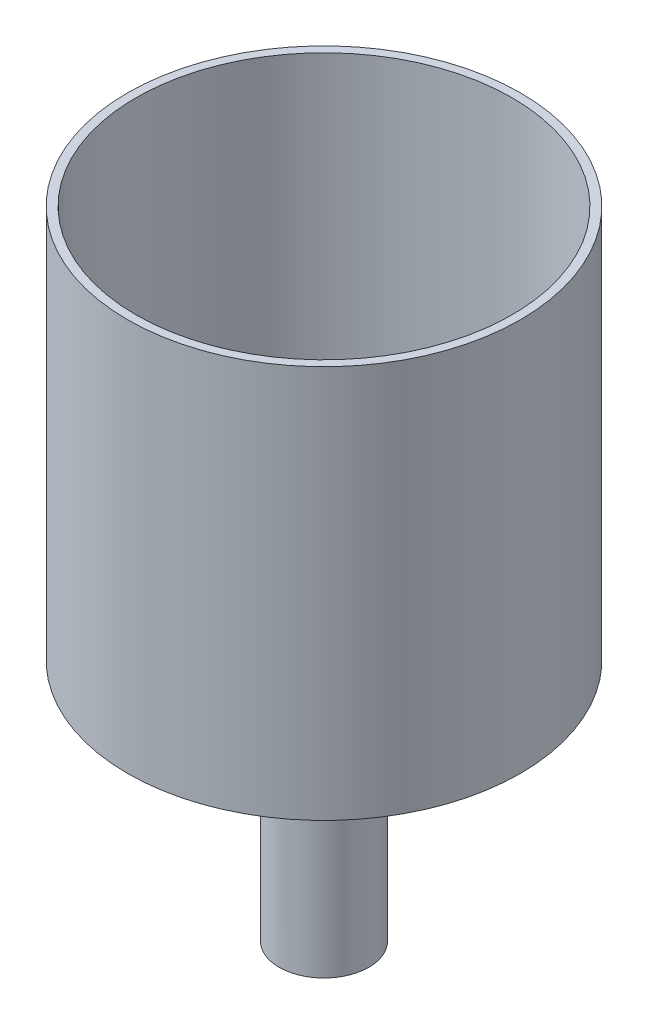
ISO-10303-21;
HEADER;
FILE_DESCRIPTION(('STEP AP214'),'2;1');
FILE_NAME('part.step','',(''),(''),'','','');
FILE_SCHEMA(('AUTOMOTIVE_DESIGN { 1 0 10303 214 1 1 1 1 }'));
ENDSEC;
DATA;
#1=APPLICATION_CONTEXT('core data for automotive mechanical design processes');
#2=APPLICATION_PROTOCOL_DEFINITION('international standard','automotive_design',2000,#1);
#3=PRODUCT_CONTEXT('',#1,'mechanical');
#4=PRODUCT('Part','Part','',(#3));
#5=PRODUCT_RELATED_PRODUCT_CATEGORY('part','',(#4));
#6=PRODUCT_DEFINITION_FORMATION('','',#4);
#7=PRODUCT_DEFINITION_CONTEXT('part definition',#1,'design');
#8=PRODUCT_DEFINITION('design','',#6,#7);
#9=PRODUCT_DEFINITION_SHAPE('','',#8);
#10=(LENGTH_UNIT() NAMED_UNIT(*) SI_UNIT(.MILLI.,.METRE.));
#11=(NAMED_UNIT(*) PLANE_ANGLE_UNIT() SI_UNIT($,.RADIAN.));
#12=(NAMED_UNIT(*) SI_UNIT($,.STERADIAN.) SOLID_ANGLE_UNIT());
#13=UNCERTAINTY_MEASURE_WITH_UNIT(LENGTH_MEASURE(1.E-05),#10,'distance_accuracy_value','');
#14=(GEOMETRIC_REPRESENTATION_CONTEXT(3) GLOBAL_UNCERTAINTY_ASSIGNED_CONTEXT((#13)) GLOBAL_UNIT_ASSIGNED_CONTEXT((#10,
#11,#12)) REPRESENTATION_CONTEXT('',''));
#15=CARTESIAN_POINT('',(0.,0.,0.));
#16=DIRECTION('',(0.,0.,1.));
#17=DIRECTION('',(1.,0.,0.));
#18=AXIS2_PLACEMENT_3D('',#15,#16,#17);
#19=CARTESIAN_POINT('',(0.,45.,0.));
#20=DIRECTION('',(0.,-1.,0.));
#21=DIRECTION('',(0.,0.,-1.));
#22=AXIS2_PLACEMENT_3D('',#19,#20,#21);
#23=CYLINDRICAL_SURFACE('',#22,8.);
#24=CARTESIAN_POINT('',(0.,1.59512829498445,0.));
#25=DIRECTION('',(0.,1.,0.));
#26=DIRECTION('',(0.,0.,1.));
#27=AXIS2_PLACEMENT_3D('',#24,#25,#26);
#28=CIRCLE('',#27,8.);
#29=CARTESIAN_POINT('',(0.,1.59512829498445,-8.));
#30=VERTEX_POINT('',#29);
#31=EDGE_CURVE('E54',#30,#30,#28,.T.);
#32=CARTESIAN_POINT('',(0.,45.,0.));
#33=DIRECTION('',(0.,1.,0.));
#34=DIRECTION('',(0.,0.,1.));
#35=AXIS2_PLACEMENT_3D('',#32,#33,#34);
#36=CIRCLE('',#35,8.);
#37=CARTESIAN_POINT('',(0.,45.,-8.));
#38=VERTEX_POINT('',#37);
#39=EDGE_CURVE('E59',#38,#38,#36,.T.);
#40=CARTESIAN_POINT('',(0.,1.59512829498445,-8.));
#41=CARTESIAN_POINT('',(0.,2.04726237524503,-8.));
#42=CARTESIAN_POINT('',(0.,2.4993964555056,-8.));
#43=CARTESIAN_POINT('',(0.,3.40366461602676,-8.));
#44=CARTESIAN_POINT('',(0.,3.85579869628734,-8.));
#45=CARTESIAN_POINT('',(0.,4.7600668568085,-8.));
#46=CARTESIAN_POINT('',(0.,5.21220093706908,-8.));
#47=CARTESIAN_POINT('',(0.,6.11646909759024,-8.));
#48=CARTESIAN_POINT('',(0.,6.56860317785081,-8.));
#49=CARTESIAN_POINT('',(0.,7.47287133837197,-8.));
#50=CARTESIAN_POINT('',(0.,7.92500541863255,-8.));
#51=CARTESIAN_POINT('',(0.,8.82927357915371,-8.));
#52=CARTESIAN_POINT('',(0.,9.28140765941428,-8.));
#53=CARTESIAN_POINT('',(0.,10.1856758199354,-8.));
#54=CARTESIAN_POINT('',(0.,10.637809900196,-8.));
#55=CARTESIAN_POINT('',(0.,11.5420780607172,-8.));
#56=CARTESIAN_POINT('',(0.,11.9942121409778,-8.));
#57=CARTESIAN_POINT('',(0.,12.8984803014989,-8.));
#58=CARTESIAN_POINT('',(0.,13.3506143817595,-8.));
#59=CARTESIAN_POINT('',(0.,14.2548825422806,-8.));
#60=CARTESIAN_POINT('',(0.,14.7070166225412,-8.));
#61=CARTESIAN_POINT('',(0.,15.6112847830624,-8.));
#62=CARTESIAN_POINT('',(0.,16.063418863323,-8.));
#63=CARTESIAN_POINT('',(0.,16.9676870238441,-8.));
#64=CARTESIAN_POINT('',(0.,17.4198211041047,-8.));
#65=CARTESIAN_POINT('',(0.,18.3240892646259,-8.));
#66=CARTESIAN_POINT('',(0.,18.7762233448864,-8.));
#67=CARTESIAN_POINT('',(0.,19.6804915054076,-8.));
#68=CARTESIAN_POINT('',(0.,20.1326255856682,-8.));
#69=CARTESIAN_POINT('',(0.,21.0368937461893,-8.));
#70=CARTESIAN_POINT('',(0.,21.4890278264499,-8.));
#71=CARTESIAN_POINT('',(0.,22.3932959869711,-8.));
#72=CARTESIAN_POINT('',(0.,22.8454300672316,-8.));
#73=CARTESIAN_POINT('',(0.,23.7496982277528,-8.));
#74=CARTESIAN_POINT('',(0.,24.2018323080134,-8.));
#75=CARTESIAN_POINT('',(0.,25.1061004685345,-8.));
#76=CARTESIAN_POINT('',(0.,25.5582345487951,-8.));
#77=CARTESIAN_POINT('',(0.,26.4625027093163,-8.));
#78=CARTESIAN_POINT('',(0.,26.9146367895768,-8.));
#79=CARTESIAN_POINT('',(0.,27.818904950098,-8.));
#80=CARTESIAN_POINT('',(0.,28.2710390303586,-8.));
#81=CARTESIAN_POINT('',(0.,29.1753071908797,-8.));
#82=CARTESIAN_POINT('',(0.,29.6274412711403,-8.));
#83=CARTESIAN_POINT('',(0.,30.5317094316615,-8.));
#84=CARTESIAN_POINT('',(0.,30.9838435119221,-8.));
#85=CARTESIAN_POINT('',(0.,31.8881116724432,-8.));
#86=CARTESIAN_POINT('',(0.,32.3402457527038,-8.));
#87=CARTESIAN_POINT('',(0.,33.2445139132249,-8.));
#88=CARTESIAN_POINT('',(0.,33.6966479934855,-8.));
#89=CARTESIAN_POINT('',(0.,34.6009161540067,-8.));
#90=CARTESIAN_POINT('',(0.,35.0530502342673,-8.));
#91=CARTESIAN_POINT('',(0.,35.9573183947884,-8.));
#92=CARTESIAN_POINT('',(0.,36.409452475049,-8.));
#93=CARTESIAN_POINT('',(0.,37.3137206355702,-8.));
#94=CARTESIAN_POINT('',(0.,37.7658547158307,-8.));
#95=CARTESIAN_POINT('',(0.,38.6701228763519,-8.));
#96=CARTESIAN_POINT('',(0.,39.1222569566125,-8.));
#97=CARTESIAN_POINT('',(0.,40.0265251171336,-8.));
#98=CARTESIAN_POINT('',(0.,40.4786591973942,-8.));
#99=CARTESIAN_POINT('',(0.,41.3829273579154,-8.));
#100=CARTESIAN_POINT('',(0.,41.8350614381759,-8.));
#101=CARTESIAN_POINT('',(0.,42.7393295986971,-8.));
#102=CARTESIAN_POINT('',(0.,43.1914636789577,-8.));
#103=CARTESIAN_POINT('',(0.,44.0957318394788,-8.));
#104=CARTESIAN_POINT('',(0.,44.5478659197394,-8.));
#105=CARTESIAN_POINT('',(0.,45.,-8.));
#106=B_SPLINE_CURVE_WITH_KNOTS('',3,(#40,#41,#42,#43,#44,#45,#46,#47,#48,#49,#50,#51,#52,#53,
#54,#55,#56,#57,#58,#59,#60,#61,#62,#63,#64,#65,#66,#67,#68,#69,#70,#71,#72,#73,#74,#75,#76,#77,
#78,#79,#80,#81,#82,#83,#84,#85,#86,#87,#88,#89,#90,#91,#92,#93,#94,#95,#96,#97,#98,#99,#100,
#101,#102,#103,#104,#105),.UNSPECIFIED.,.F.,.F.,(4,2,2,2,2,2,2,2,2,2,2,2,2,2,2,2,2,2,2,2,2,2,2,
2,2,2,2,2,2,2,2,2,4),(0.,1.35640224078173,2.71280448156347,4.06920672234521,5.42560896312694,
6.78201120390868,8.13841344469041,9.49481568547215,10.8512179262539,12.2076201670356,
13.5640224078174,14.9204246485991,16.2768268893808,17.6332291301626,18.9896313709443,
20.346033611726,21.7024358525078,23.0588380932895,24.4152403340712,25.771642574853,
27.1280448156347,28.4844470564164,29.8408492971982,31.1972515379799,32.5536537787617,
33.9100560195434,35.2664582603251,36.6228605011069,37.9792627418886,39.3356649826703,
40.6920672234521,42.0484694642338,43.4048717050155),.UNSPECIFIED.);
#107=EDGE_CURVE('BSEAM40',#30,#38,#106,.T.);
#108=ORIENTED_EDGE('',*,*,#31,.T.);
#109=ORIENTED_EDGE('',*,*,#39,.F.);
#110=ORIENTED_EDGE('',*,*,#107,.T.);
#111=ORIENTED_EDGE('',*,*,#107,.F.);
#112=EDGE_LOOP('',(#108,#110,#109,#111));
#113=FACE_BOUND('',#112,.T.);
#114=ADVANCED_FACE('F40',(#113),#23,.T.);
#115=CARTESIAN_POINT('',(0.,0.,0.));
#116=DIRECTION('',(0.,1.,0.));
#117=DIRECTION('',(0.,0.,1.));
#118=AXIS2_PLACEMENT_3D('',#115,#116,#117);
#119=PLANE('',#118);
#120=CARTESIAN_POINT('',(0.,0.,0.));
#121=DIRECTION('',(0.,1.,0.));
#122=DIRECTION('',(0.,0.,1.));
#123=AXIS2_PLACEMENT_3D('',#120,#121,#122);
#124=CIRCLE('',#123,4.99999999999995);
#125=CARTESIAN_POINT('',(0.,0.,4.99999999999995));
#126=VERTEX_POINT('',#125);
#127=EDGE_CURVE('E49',#126,#126,#124,.F.);
#128=ORIENTED_EDGE('',*,*,#127,.T.);
#129=EDGE_LOOP('',(#128));
#130=FACE_BOUND('',#129,.T.);
#131=ADVANCED_FACE('F129',(#130),#119,.F.);
#132=CARTESIAN_POINT('',(0.,1.59512829498445,0.));
#133=DIRECTION('',(0.,1.,0.));
#134=DIRECTION('',(0.,0.,1.));
#135=AXIS2_PLACEMENT_3D('',#132,#133,#134);
#136=CONICAL_SURFACE('',#135,8.,1.08210413623649);
#137=ORIENTED_EDGE('',*,*,#127,.F.);
#138=EDGE_LOOP('',(#137));
#139=FACE_BOUND('',#138,.T.);
#140=ORIENTED_EDGE('',*,*,#31,.F.);
#141=EDGE_LOOP('',(#140));
#142=FACE_BOUND('',#141,.T.);
#143=ADVANCED_FACE('F42',(#139,#142),#136,.T.);
#144=CARTESIAN_POINT('',(0.,115.,0.));
#145=DIRECTION('',(0.,-1.,0.));
#146=DIRECTION('',(0.,0.,-1.));
#147=AXIS2_PLACEMENT_3D('',#144,#145,#146);
#148=CYLINDRICAL_SURFACE('',#147,35.);
#149=CARTESIAN_POINT('',(0.,115.,0.));
#150=DIRECTION('',(0.,1.,0.));
#151=DIRECTION('',(0.,0.,1.));
#152=AXIS2_PLACEMENT_3D('',#149,#150,#151);
#153=CIRCLE('',#152,35.);
#154=CARTESIAN_POINT('',(0.,115.,35.));
#155=VERTEX_POINT('',#154);
#156=EDGE_CURVE('E65',#155,#155,#153,.T.);
#157=ORIENTED_EDGE('',*,*,#156,.F.);
#158=EDGE_LOOP('',(#157));
#159=FACE_BOUND('',#158,.T.);
#160=CARTESIAN_POINT('',(0.,45.,0.));
#161=DIRECTION('',(0.,1.,0.));
#162=DIRECTION('',(0.,0.,1.));
#163=AXIS2_PLACEMENT_3D('',#160,#161,#162);
#164=CIRCLE('',#163,35.);
#165=CARTESIAN_POINT('',(0.,45.,35.));
#166=VERTEX_POINT('',#165);
#167=EDGE_CURVE('E66',#166,#166,#164,.T.);
#168=ORIENTED_EDGE('',*,*,#167,.T.);
#169=EDGE_LOOP('',(#168));
#170=FACE_BOUND('',#169,.T.);
#171=ADVANCED_FACE('F121',(#159,#170),#148,.T.);
#172=CARTESIAN_POINT('',(0.,115.,0.));
#173=DIRECTION('',(0.,1.,0.));
#174=DIRECTION('',(0.,0.,1.));
#175=AXIS2_PLACEMENT_3D('',#172,#173,#174);
#176=PLANE('',#175);
#177=CARTESIAN_POINT('',(0.,115.,0.));
#178=DIRECTION('',(0.,1.,0.));
#179=DIRECTION('',(0.,0.,1.));
#180=AXIS2_PLACEMENT_3D('',#177,#178,#179);
#181=CIRCLE('',#180,33.5);
#182=CARTESIAN_POINT('',(0.,115.,33.5));
#183=VERTEX_POINT('',#182);
#184=EDGE_CURVE('E74',#183,#183,#181,.T.);
#185=ORIENTED_EDGE('',*,*,#184,.F.);
#186=EDGE_LOOP('',(#185));
#187=FACE_BOUND('',#186,.T.);
#188=ORIENTED_EDGE('',*,*,#156,.T.);
#189=EDGE_LOOP('',(#188));
#190=FACE_BOUND('',#189,.T.);
#191=ADVANCED_FACE('F118',(#187,#190),#176,.T.);
#192=CARTESIAN_POINT('',(0.,45.,0.));
#193=DIRECTION('',(0.,1.,0.));
#194=DIRECTION('',(0.,0.,1.));
#195=AXIS2_PLACEMENT_3D('',#192,#193,#194);
#196=PLANE('',#195);
#197=ORIENTED_EDGE('',*,*,#39,.T.);
#198=EDGE_LOOP('',(#197));
#199=FACE_BOUND('',#198,.T.);
#200=ORIENTED_EDGE('',*,*,#167,.F.);
#201=EDGE_LOOP('',(#200));
#202=FACE_BOUND('',#201,.T.);
#203=ADVANCED_FACE('F116',(#199,#202),#196,.F.);
#204=CARTESIAN_POINT('',(0.,115.,0.));
#205=DIRECTION('',(0.,-1.,0.));
#206=DIRECTION('',(0.,0.,-1.));
#207=AXIS2_PLACEMENT_3D('',#204,#205,#206);
#208=CYLINDRICAL_SURFACE('',#207,33.5);
#209=CARTESIAN_POINT('',(0.,48.5,0.));
#210=DIRECTION('',(0.,1.,0.));
#211=DIRECTION('',(0.,0.,1.));
#212=AXIS2_PLACEMENT_3D('',#209,#210,#211);
#213=CIRCLE('',#212,33.5);
#214=CARTESIAN_POINT('',(0.,48.5,33.5));
#215=VERTEX_POINT('',#214);
#216=EDGE_CURVE('E10',#215,#215,#213,.T.);
#217=ORIENTED_EDGE('',*,*,#216,.F.);
#218=EDGE_LOOP('',(#217));
#219=FACE_BOUND('',#218,.T.);
#220=ORIENTED_EDGE('',*,*,#184,.T.);
#221=EDGE_LOOP('',(#220));
#222=FACE_BOUND('',#221,.T.);
#223=ADVANCED_FACE('F113',(#219,#222),#208,.F.);
#224=CARTESIAN_POINT('',(0.,48.5,0.));
#225=DIRECTION('',(0.,1.,0.));
#226=DIRECTION('',(0.,0.,1.));
#227=AXIS2_PLACEMENT_3D('',#224,#225,#226);
#228=PLANE('',#227);
#229=ORIENTED_EDGE('',*,*,#216,.T.);
#230=EDGE_LOOP('',(#229));
#231=FACE_BOUND('',#230,.T.);
#232=ADVANCED_FACE('F106',(#231),#228,.T.);
#233=CLOSED_SHELL('',(#114,#131,#143,#171,#191,#203,#223,#232));
#234=CARTESIAN_POINT('',(0.,46.5,0.));
#235=DIRECTION('',(0.,1.,0.));
#236=DIRECTION('',(0.,0.,1.));
#237=AXIS2_PLACEMENT_3D('',#234,#235,#236);
#238=PLANE('',#237);
#239=CARTESIAN_POINT('',(0.,46.5,0.));
#240=DIRECTION('',(0.,1.,0.));
#241=DIRECTION('',(0.,0.,1.));
#242=AXIS2_PLACEMENT_3D('',#239,#240,#241);
#243=CIRCLE('',#242,6.5);
#244=CARTESIAN_POINT('',(0.,46.5,6.5));
#245=VERTEX_POINT('',#244);
#246=EDGE_CURVE('E79',#245,#245,#243,.T.);
#247=ORIENTED_EDGE('',*,*,#246,.F.);
#248=EDGE_LOOP('',(#247));
#249=FACE_BOUND('',#248,.T.);
#250=ADVANCED_FACE('F92',(#249),#238,.F.);
#251=CARTESIAN_POINT('',(0.,1.5,0.));
#252=DIRECTION('',(0.,1.,0.));
#253=DIRECTION('',(0.,0.,1.));
#254=AXIS2_PLACEMENT_3D('',#251,#252,#253);
#255=PLANE('',#254);
#256=CARTESIAN_POINT('',(0.,1.5,0.));
#257=DIRECTION('',(0.,1.,0.));
#258=DIRECTION('',(0.,0.,1.));
#259=AXIS2_PLACEMENT_3D('',#256,#257,#258);
#260=CIRCLE('',#259,4.62600799573519);
#261=CARTESIAN_POINT('',(0.,1.5,4.62600799573519));
#262=VERTEX_POINT('',#261);
#263=EDGE_CURVE('E70',#262,#262,#260,.F.);
#264=ORIENTED_EDGE('',*,*,#263,.F.);
#265=EDGE_LOOP('',(#264));
#266=FACE_BOUND('',#265,.T.);
#267=ADVANCED_FACE('F94',(#266),#255,.T.);
#268=CARTESIAN_POINT('',(0.,2.91954968427284,0.));
#269=DIRECTION('',(0.,1.,0.));
#270=DIRECTION('',(0.,0.,1.));
#271=AXIS2_PLACEMENT_3D('',#268,#269,#270);
#272=CONICAL_SURFACE('',#271,7.29579265582117,1.08210413623649);
#273=CARTESIAN_POINT('',(0.,2.49641922352579,0.));
#274=DIRECTION('',(0.,1.,0.));
#275=DIRECTION('',(0.,0.,1.));
#276=AXIS2_PLACEMENT_3D('',#273,#274,#275);
#277=CIRCLE('',#276,6.5);
#278=CARTESIAN_POINT('',(0.,2.49641922352579,6.5));
#279=VERTEX_POINT('',#278);
#280=EDGE_CURVE('E78',#279,#279,#277,.T.);
#281=CARTESIAN_POINT('',(0.,1.5,4.62600799573519));
#282=CARTESIAN_POINT('',(0.,1.51037936691173,4.64552874577961));
#283=CARTESIAN_POINT('',(0.,1.52075873382345,4.66504949582404));
#284=CARTESIAN_POINT('',(0.,1.54151746764691,4.70409099591289));
#285=CARTESIAN_POINT('',(0.,1.55189683455863,4.72361174595731));
#286=CARTESIAN_POINT('',(0.,1.57265556838209,4.76265324604616));
#287=CARTESIAN_POINT('',(0.,1.58303493529382,4.78217399609059));
#288=CARTESIAN_POINT('',(0.,1.60379366911727,4.82121549617944));
#289=CARTESIAN_POINT('',(0.,1.614173036029,4.84073624622386));
#290=CARTESIAN_POINT('',(0.,1.63493176985245,4.87977774631271));
#291=CARTESIAN_POINT('',(0.,1.64531113676418,4.89929849635714));
#292=CARTESIAN_POINT('',(0.,1.66606987058763,4.93833999644599));
#293=CARTESIAN_POINT('',(0.,1.67644923749936,4.95786074649041));
#294=CARTESIAN_POINT('',(0.,1.69720797132281,4.99690224657926));
#295=CARTESIAN_POINT('',(0.,1.70758733823454,5.01642299662369));
#296=CARTESIAN_POINT('',(0.,1.72834607205799,5.05546449671254));
#297=CARTESIAN_POINT('',(0.,1.73872543896972,5.07498524675696));
#298=CARTESIAN_POINT('',(0.,1.75948417279317,5.11402674684581));
#299=CARTESIAN_POINT('',(0.,1.7698635397049,5.13354749689024));
#300=CARTESIAN_POINT('',(0.,1.79062227352836,5.17258899697909));
#301=CARTESIAN_POINT('',(0.,1.80100164044008,5.19210974702352));
#302=CARTESIAN_POINT('',(0.,1.82176037426354,5.23115124711237));
#303=CARTESIAN_POINT('',(0.,1.83213974117526,5.25067199715679));
#304=CARTESIAN_POINT('',(0.,1.85289847499872,5.28971349724564));
#305=CARTESIAN_POINT('',(0.,1.86327784191044,5.30923424729007));
#306=CARTESIAN_POINT('',(0.,1.8840365757339,5.34827574737892));
#307=CARTESIAN_POINT('',(0.,1.89441594264563,5.36779649742334));
#308=CARTESIAN_POINT('',(0.,1.91517467646908,5.40683799751219));
#309=CARTESIAN_POINT('',(0.,1.92555404338081,5.42635874755662));
#310=CARTESIAN_POINT('',(0.,1.94631277720426,5.46540024764547));
#311=CARTESIAN_POINT('',(0.,1.95669214411599,5.48492099768989));
#312=CARTESIAN_POINT('',(0.,1.97745087793944,5.52396249777874));
#313=CARTESIAN_POINT('',(0.,1.98783024485117,5.54348324782317));
#314=CARTESIAN_POINT('',(0.,2.00858897867462,5.58252474791202));
#315=CARTESIAN_POINT('',(0.,2.01896834558635,5.60204549795644));
#316=CARTESIAN_POINT('',(0.,2.0397270794098,5.64108699804529));
#317=CARTESIAN_POINT('',(0.,2.05010644632153,5.66060774808972));
#318=CARTESIAN_POINT('',(0.,2.07086518014498,5.69964924817857));
#319=CARTESIAN_POINT('',(0.,2.08124454705671,5.71916999822299));
#320=CARTESIAN_POINT('',(0.,2.10200328088017,5.75821149831184));
#321=CARTESIAN_POINT('',(0.,2.11238264779189,5.77773224835627));
#322=CARTESIAN_POINT('',(0.,2.13314138161535,5.81677374844512));
#323=CARTESIAN_POINT('',(0.,2.14352074852707,5.83629449848954));
#324=CARTESIAN_POINT('',(0.,2.16427948235053,5.87533599857839));
#325=CARTESIAN_POINT('',(0.,2.17465884926225,5.89485674862282));
#326=CARTESIAN_POINT('',(0.,2.19541758308571,5.93389824871167));
#327=CARTESIAN_POINT('',(0.,2.20579694999744,5.9534189987561));
#328=CARTESIAN_POINT('',(0.,2.22655568382089,5.99246049884495));
#329=CARTESIAN_POINT('',(0.,2.23693505073262,6.01198124888937));
#330=CARTESIAN_POINT('',(0.,2.25769378455607,6.05102274897822));
#331=CARTESIAN_POINT('',(0.,2.2680731514678,6.07054349902265));
#332=CARTESIAN_POINT('',(0.,2.28883188529125,6.1095849991115));
#333=CARTESIAN_POINT('',(0.,2.29921125220298,6.12910574915592));
#334=CARTESIAN_POINT('',(0.,2.31996998602643,6.16814724924477));
#335=CARTESIAN_POINT('',(0.,2.33034935293816,6.1876679992892));
#336=CARTESIAN_POINT('',(0.,2.35110808676161,6.22670949937805));
#337=CARTESIAN_POINT('',(0.,2.36148745367334,6.24623024942247));
#338=CARTESIAN_POINT('',(0.,2.38224618749679,6.28527174951132));
#339=CARTESIAN_POINT('',(0.,2.39262555440852,6.30479249955575));
#340=CARTESIAN_POINT('',(0.,2.41338428823198,6.3438339996446));
#341=CARTESIAN_POINT('',(0.,2.4237636551437,6.36335474968902));
#342=CARTESIAN_POINT('',(0.,2.44452238896716,6.40239624977787));
#343=CARTESIAN_POINT('',(0.,2.45490175587888,6.4219169998223));
#344=CARTESIAN_POINT('',(0.,2.47566048970234,6.46095849991115));
#345=CARTESIAN_POINT('',(0.,2.48603985661406,6.48047924995557));
#346=CARTESIAN_POINT('',(0.,2.49641922352579,6.5));
#347=B_SPLINE_CURVE_WITH_KNOTS('',3,(#281,#282,#283,#284,#285,#286,#287,#288,#289,#290,#291,
#292,#293,#294,#295,#296,#297,#298,#299,#300,#301,#302,#303,#304,#305,#306,#307,#308,#309,#310,
#311,#312,#313,#314,#315,#316,#317,#318,#319,#320,#321,#322,#323,#324,#325,#326,#327,#328,#329,
#330,#331,#332,#333,#334,#335,#336,#337,#338,#339,#340,#341,#342,#343,#344,#345,#346),
.UNSPECIFIED.,.F.,.F.,(4,2,2,2,2,2,2,2,2,2,2,2,2,2,2,2,2,2,2,2,2,2,2,2,2,2,2,2,2,2,2,2,4),(0.,
0.0663258506019083,0.132651701203816,0.198977551805723,0.265303402407632,0.331629253009539,
0.397955103611447,0.464280954213355,0.530606804815262,0.596932655417171,0.663258506019079,
0.729584356620986,0.795910207222894,0.862236057824801,0.928561908426709,0.994887759028617,
1.06121360963052,1.12753946023243,1.19386531083434,1.26019116143625,1.32651701203816,
1.39284286264006,1.45916871324197,1.52549456384388,1.59182041444579,1.6581462650477,
1.7244721156496,1.79079796625151,1.85712381685342,1.92344966745533,1.98977551805723,
2.05610136865914,2.12242721926105),.UNSPECIFIED.);
#348=EDGE_CURVE('BSEAM101',#262,#279,#347,.T.);
#349=ORIENTED_EDGE('',*,*,#263,.T.);
#350=ORIENTED_EDGE('',*,*,#280,.T.);
#351=ORIENTED_EDGE('',*,*,#348,.T.);
#352=ORIENTED_EDGE('',*,*,#348,.F.);
#353=EDGE_LOOP('',(#349,#351,#350,#352));
#354=FACE_BOUND('',#353,.T.);
#355=ADVANCED_FACE('F101',(#354),#272,.F.);
#356=CARTESIAN_POINT('',(0.,45.,0.));
#357=DIRECTION('',(0.,-1.,0.));
#358=DIRECTION('',(0.,0.,-1.));
#359=AXIS2_PLACEMENT_3D('',#356,#357,#358);
#360=CYLINDRICAL_SURFACE('',#359,6.5);
#361=ORIENTED_EDGE('',*,*,#280,.F.);
#362=EDGE_LOOP('',(#361));
#363=FACE_BOUND('',#362,.T.);
#364=ORIENTED_EDGE('',*,*,#246,.T.);
#365=EDGE_LOOP('',(#364));
#366=FACE_BOUND('',#365,.T.);
#367=ADVANCED_FACE('F90',(#363,#366),#360,.F.);
#368=CLOSED_SHELL('',(#250,#267,#355,#367));
#369=ORIENTED_CLOSED_SHELL('',*,#368,.T.);
#370=BREP_WITH_VOIDS('B2',#233,(#369));
#371=ADVANCED_BREP_SHAPE_REPRESENTATION('',(#18,#370),#14);
#372=SHAPE_DEFINITION_REPRESENTATION(#9,#371);
ENDSEC;
END-ISO-10303-21;
